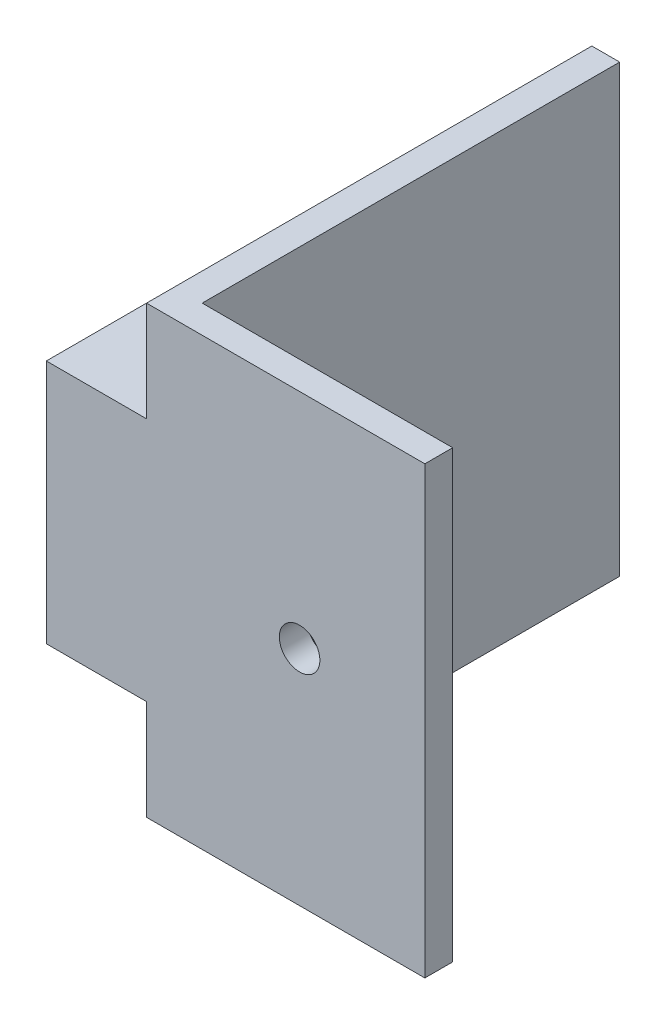
ISO-10303-21;
HEADER;
FILE_DESCRIPTION(('STEP AP214'),'2;1');
FILE_NAME('part.step','',(''),(''),'','','');
FILE_SCHEMA(('AUTOMOTIVE_DESIGN { 1 0 10303 214 1 1 1 1 }'));
ENDSEC;
DATA;
#1=APPLICATION_CONTEXT('core data for automotive mechanical design processes');
#2=APPLICATION_PROTOCOL_DEFINITION('international standard','automotive_design',2000,#1);
#3=PRODUCT_CONTEXT('',#1,'mechanical');
#4=PRODUCT('Part','Part','',(#3));
#5=PRODUCT_RELATED_PRODUCT_CATEGORY('part','',(#4));
#6=PRODUCT_DEFINITION_FORMATION('','',#4);
#7=PRODUCT_DEFINITION_CONTEXT('part definition',#1,'design');
#8=PRODUCT_DEFINITION('design','',#6,#7);
#9=PRODUCT_DEFINITION_SHAPE('','',#8);
#10=(LENGTH_UNIT() NAMED_UNIT(*) SI_UNIT(.MILLI.,.METRE.));
#11=(NAMED_UNIT(*) PLANE_ANGLE_UNIT() SI_UNIT($,.RADIAN.));
#12=(NAMED_UNIT(*) SI_UNIT($,.STERADIAN.) SOLID_ANGLE_UNIT());
#13=UNCERTAINTY_MEASURE_WITH_UNIT(LENGTH_MEASURE(1.E-05),#10,'distance_accuracy_value','');
#14=(GEOMETRIC_REPRESENTATION_CONTEXT(3) GLOBAL_UNCERTAINTY_ASSIGNED_CONTEXT((#13)) GLOBAL_UNIT_ASSIGNED_CONTEXT((#10,
#11,#12)) REPRESENTATION_CONTEXT('',''));
#15=CARTESIAN_POINT('',(0.,0.,0.));
#16=DIRECTION('',(0.,0.,1.));
#17=DIRECTION('',(1.,0.,0.));
#18=AXIS2_PLACEMENT_3D('',#15,#16,#17);
#19=CARTESIAN_POINT('',(0.,50.8,0.));
#20=DIRECTION('',(1.,0.,0.));
#21=DIRECTION('',(0.,0.,-1.));
#22=AXIS2_PLACEMENT_3D('',#19,#20,#21);
#23=PLANE('',#22);
#24=DIRECTION('',(0.,0.,1.));
#25=VECTOR('',#24,1.);
#26=CARTESIAN_POINT('',(0.,11.43,-50.8));
#27=LINE('',#26,#25);
#28=CARTESIAN_POINT('',(0.,11.43,-50.8));
#29=VERTEX_POINT('',#28);
#30=CARTESIAN_POINT('',(0.,11.43,0.));
#31=VERTEX_POINT('',#30);
#32=EDGE_CURVE('E52',#29,#31,#27,.T.);
#33=ORIENTED_EDGE('',*,*,#32,.F.);
#34=DIRECTION('',(0.,-1.,0.));
#35=VECTOR('',#34,1.);
#36=CARTESIAN_POINT('',(0.,50.8,-50.8));
#37=LINE('',#36,#35);
#38=CARTESIAN_POINT('',(0.,0.,-50.8));
#39=VERTEX_POINT('',#38);
#40=EDGE_CURVE('E196',#29,#39,#37,.T.);
#41=ORIENTED_EDGE('',*,*,#40,.T.);
#42=DIRECTION('',(0.,0.,1.));
#43=VECTOR('',#42,1.);
#44=CARTESIAN_POINT('',(0.,0.,0.));
#45=LINE('',#44,#43);
#46=CARTESIAN_POINT('',(0.,0.,0.));
#47=VERTEX_POINT('',#46);
#48=EDGE_CURVE('E167',#39,#47,#45,.T.);
#49=ORIENTED_EDGE('',*,*,#48,.T.);
#50=DIRECTION('',(0.,-1.,0.));
#51=VECTOR('',#50,1.);
#52=CARTESIAN_POINT('',(0.,50.8,0.));
#53=LINE('',#52,#51);
#54=EDGE_CURVE('E57',#31,#47,#53,.T.);
#55=ORIENTED_EDGE('',*,*,#54,.F.);
#56=EDGE_LOOP('',(#33,#41,#49,#55));
#57=FACE_BOUND('',#56,.T.);
#58=ADVANCED_FACE('F35',(#57),#23,.F.);
#59=DIRECTION('',(0.,0.,-1.));
#60=VECTOR('',#59,1.);
#61=CARTESIAN_POINT('',(0.,39.37,-50.8));
#62=LINE('',#61,#60);
#63=CARTESIAN_POINT('',(0.,39.37,0.));
#64=VERTEX_POINT('',#63);
#65=CARTESIAN_POINT('',(0.,39.37,-50.8));
#66=VERTEX_POINT('',#65);
#67=EDGE_CURVE('E152',#64,#66,#62,.T.);
#68=ORIENTED_EDGE('',*,*,#67,.F.);
#69=CARTESIAN_POINT('',(0.,50.8,0.));
#70=VERTEX_POINT('',#69);
#71=EDGE_CURVE('E137',#70,#64,#53,.T.);
#72=ORIENTED_EDGE('',*,*,#71,.F.);
#73=DIRECTION('',(0.,0.,1.));
#74=VECTOR('',#73,1.);
#75=CARTESIAN_POINT('',(0.,50.8,0.));
#76=LINE('',#75,#74);
#77=CARTESIAN_POINT('',(0.,50.8,-50.8));
#78=VERTEX_POINT('',#77);
#79=EDGE_CURVE('E175',#78,#70,#76,.T.);
#80=ORIENTED_EDGE('',*,*,#79,.F.);
#81=EDGE_CURVE('E204',#78,#66,#37,.T.);
#82=ORIENTED_EDGE('',*,*,#81,.T.);
#83=EDGE_LOOP('',(#68,#72,#80,#82));
#84=FACE_BOUND('',#83,.T.);
#85=ADVANCED_FACE('F231',(#84),#23,.F.);
#86=CARTESIAN_POINT('',(31.75,50.8,0.));
#87=DIRECTION('',(0.,0.,-1.));
#88=DIRECTION('',(-1.,0.,0.));
#89=AXIS2_PLACEMENT_3D('',#86,#87,#88);
#90=PLANE('',#89);
#91=CARTESIAN_POINT('',(17.4625,25.4,0.));
#92=DIRECTION('',(0.,0.,-1.));
#93=DIRECTION('',(-1.,0.,0.));
#94=AXIS2_PLACEMENT_3D('',#91,#92,#93);
#95=CIRCLE('',#94,2.3114);
#96=CARTESIAN_POINT('',(15.1511,25.4,0.));
#97=VERTEX_POINT('',#96);
#98=EDGE_CURVE('E141',#97,#97,#95,.T.);
#99=ORIENTED_EDGE('',*,*,#98,.T.);
#100=EDGE_LOOP('',(#99));
#101=FACE_BOUND('',#100,.T.);
#102=DIRECTION('',(1.,0.,0.));
#103=VECTOR('',#102,1.);
#104=CARTESIAN_POINT('',(31.75,0.,0.));
#105=LINE('',#104,#103);
#106=CARTESIAN_POINT('',(31.75,0.,0.));
#107=VERTEX_POINT('',#106);
#108=EDGE_CURVE('E162',#47,#107,#105,.T.);
#109=ORIENTED_EDGE('',*,*,#108,.T.);
#110=DIRECTION('',(0.,-1.,0.));
#111=VECTOR('',#110,1.);
#112=CARTESIAN_POINT('',(31.75,50.8,0.));
#113=LINE('',#112,#111);
#114=CARTESIAN_POINT('',(31.75,50.8,0.));
#115=VERTEX_POINT('',#114);
#116=EDGE_CURVE('E11',#115,#107,#113,.T.);
#117=ORIENTED_EDGE('',*,*,#116,.F.);
#118=DIRECTION('',(1.,0.,0.));
#119=VECTOR('',#118,1.);
#120=CARTESIAN_POINT('',(31.75,50.8,0.));
#121=LINE('',#120,#119);
#122=EDGE_CURVE('E163',#70,#115,#121,.T.);
#123=ORIENTED_EDGE('',*,*,#122,.F.);
#124=ORIENTED_EDGE('',*,*,#71,.T.);
#125=DIRECTION('',(1.,0.,0.));
#126=VECTOR('',#125,1.);
#127=CARTESIAN_POINT('',(-11.43,39.37,0.));
#128=LINE('',#127,#126);
#129=CARTESIAN_POINT('',(-11.43,39.37,0.));
#130=VERTEX_POINT('',#129);
#131=EDGE_CURVE('E117',#130,#64,#128,.T.);
#132=ORIENTED_EDGE('',*,*,#131,.F.);
#133=DIRECTION('',(0.,1.,0.));
#134=VECTOR('',#133,1.);
#135=CARTESIAN_POINT('',(-11.43,11.43,0.));
#136=LINE('',#135,#134);
#137=CARTESIAN_POINT('',(-11.43,11.43,0.));
#138=VERTEX_POINT('',#137);
#139=EDGE_CURVE('E123',#138,#130,#136,.T.);
#140=ORIENTED_EDGE('',*,*,#139,.F.);
#141=DIRECTION('',(1.,0.,0.));
#142=VECTOR('',#141,1.);
#143=CARTESIAN_POINT('',(-11.43,11.43,0.));
#144=LINE('',#143,#142);
#145=EDGE_CURVE('E153',#138,#31,#144,.T.);
#146=ORIENTED_EDGE('',*,*,#145,.T.);
#147=ORIENTED_EDGE('',*,*,#54,.T.);
#148=EDGE_LOOP('',(#109,#117,#123,#124,#132,#140,#146,#147));
#149=FACE_BOUND('',#148,.T.);
#150=ADVANCED_FACE('F37',(#101,#149),#90,.F.);
#151=CARTESIAN_POINT('',(31.75,50.8,-3.175));
#152=DIRECTION('',(-1.,0.,0.));
#153=DIRECTION('',(0.,0.,1.));
#154=AXIS2_PLACEMENT_3D('',#151,#152,#153);
#155=PLANE('',#154);
#156=DIRECTION('',(0.,0.,-1.));
#157=VECTOR('',#156,1.);
#158=CARTESIAN_POINT('',(31.75,0.,-3.175));
#159=LINE('',#158,#157);
#160=CARTESIAN_POINT('',(31.75,0.,-3.175));
#161=VERTEX_POINT('',#160);
#162=EDGE_CURVE('E178',#107,#161,#159,.T.);
#163=ORIENTED_EDGE('',*,*,#162,.T.);
#164=DIRECTION('',(0.,-1.,0.));
#165=VECTOR('',#164,1.);
#166=CARTESIAN_POINT('',(31.75,50.8,-3.175));
#167=LINE('',#166,#165);
#168=CARTESIAN_POINT('',(31.75,50.8,-3.175));
#169=VERTEX_POINT('',#168);
#170=EDGE_CURVE('E44',#169,#161,#167,.T.);
#171=ORIENTED_EDGE('',*,*,#170,.F.);
#172=DIRECTION('',(0.,0.,-1.));
#173=VECTOR('',#172,1.);
#174=CARTESIAN_POINT('',(31.75,50.8,-3.175));
#175=LINE('',#174,#173);
#176=EDGE_CURVE('E166',#115,#169,#175,.T.);
#177=ORIENTED_EDGE('',*,*,#176,.F.);
#178=ORIENTED_EDGE('',*,*,#116,.T.);
#179=EDGE_LOOP('',(#163,#171,#177,#178));
#180=FACE_BOUND('',#179,.T.);
#181=ADVANCED_FACE('F249',(#180),#155,.F.);
#182=CARTESIAN_POINT('',(3.17500000000001,50.8,-3.175));
#183=DIRECTION('',(0.,0.,1.));
#184=DIRECTION('',(1.,0.,0.));
#185=AXIS2_PLACEMENT_3D('',#182,#183,#184);
#186=PLANE('',#185);
#187=CARTESIAN_POINT('',(17.4625,25.4,-3.175));
#188=DIRECTION('',(0.,0.,-1.));
#189=DIRECTION('',(-1.,0.,0.));
#190=AXIS2_PLACEMENT_3D('',#187,#188,#189);
#191=CIRCLE('',#190,2.31139999999999);
#192=CARTESIAN_POINT('',(15.1511,25.4,-3.175));
#193=VERTEX_POINT('',#192);
#194=EDGE_CURVE('E138',#193,#193,#191,.T.);
#195=ORIENTED_EDGE('',*,*,#194,.F.);
#196=EDGE_LOOP('',(#195));
#197=FACE_BOUND('',#196,.T.);
#198=DIRECTION('',(-1.,0.,0.));
#199=VECTOR('',#198,1.);
#200=CARTESIAN_POINT('',(3.17500000000001,0.,-3.175));
#201=LINE('',#200,#199);
#202=CARTESIAN_POINT('',(3.17500000000001,0.,-3.175));
#203=VERTEX_POINT('',#202);
#204=EDGE_CURVE('E180',#161,#203,#201,.T.);
#205=ORIENTED_EDGE('',*,*,#204,.T.);
#206=DIRECTION('',(0.,-1.,0.));
#207=VECTOR('',#206,1.);
#208=CARTESIAN_POINT('',(3.17500000000001,50.8,-3.175));
#209=LINE('',#208,#207);
#210=CARTESIAN_POINT('',(3.17500000000001,50.8,-3.175));
#211=VERTEX_POINT('',#210);
#212=EDGE_CURVE('E200',#211,#203,#209,.T.);
#213=ORIENTED_EDGE('',*,*,#212,.F.);
#214=DIRECTION('',(-1.,0.,0.));
#215=VECTOR('',#214,1.);
#216=CARTESIAN_POINT('',(3.17500000000001,50.8,-3.175));
#217=LINE('',#216,#215);
#218=EDGE_CURVE('E169',#169,#211,#217,.T.);
#219=ORIENTED_EDGE('',*,*,#218,.F.);
#220=ORIENTED_EDGE('',*,*,#170,.T.);
#221=EDGE_LOOP('',(#205,#213,#219,#220));
#222=FACE_BOUND('',#221,.T.);
#223=ADVANCED_FACE('F246',(#197,#222),#186,.F.);
#224=CARTESIAN_POINT('',(3.175,50.8,-50.8));
#225=DIRECTION('',(-1.,0.,0.));
#226=DIRECTION('',(0.,0.,1.));
#227=AXIS2_PLACEMENT_3D('',#224,#225,#226);
#228=PLANE('',#227);
#229=DIRECTION('',(0.,0.,-1.));
#230=VECTOR('',#229,1.);
#231=CARTESIAN_POINT('',(3.175,0.,-50.8));
#232=LINE('',#231,#230);
#233=CARTESIAN_POINT('',(3.175,0.,-50.8));
#234=VERTEX_POINT('',#233);
#235=EDGE_CURVE('E182',#203,#234,#232,.T.);
#236=ORIENTED_EDGE('',*,*,#235,.T.);
#237=DIRECTION('',(0.,-1.,0.));
#238=VECTOR('',#237,1.);
#239=CARTESIAN_POINT('',(3.175,50.8,-50.8));
#240=LINE('',#239,#238);
#241=CARTESIAN_POINT('',(3.175,50.8,-50.8));
#242=VERTEX_POINT('',#241);
#243=EDGE_CURVE('E202',#242,#234,#240,.T.);
#244=ORIENTED_EDGE('',*,*,#243,.F.);
#245=DIRECTION('',(0.,0.,-1.));
#246=VECTOR('',#245,1.);
#247=CARTESIAN_POINT('',(3.175,50.8,-50.8));
#248=LINE('',#247,#246);
#249=EDGE_CURVE('E171',#211,#242,#248,.T.);
#250=ORIENTED_EDGE('',*,*,#249,.F.);
#251=ORIENTED_EDGE('',*,*,#212,.T.);
#252=EDGE_LOOP('',(#236,#244,#250,#251));
#253=FACE_BOUND('',#252,.T.);
#254=ADVANCED_FACE('F243',(#253),#228,.F.);
#255=CARTESIAN_POINT('',(0.,50.8,-50.8));
#256=DIRECTION('',(0.,0.,1.));
#257=DIRECTION('',(1.,0.,0.));
#258=AXIS2_PLACEMENT_3D('',#255,#256,#257);
#259=PLANE('',#258);
#260=DIRECTION('',(-1.,0.,0.));
#261=VECTOR('',#260,1.);
#262=CARTESIAN_POINT('',(0.,0.,-50.8));
#263=LINE('',#262,#261);
#264=EDGE_CURVE('E184',#234,#39,#263,.T.);
#265=ORIENTED_EDGE('',*,*,#264,.T.);
#266=ORIENTED_EDGE('',*,*,#40,.F.);
#267=DIRECTION('',(1.,0.,0.));
#268=VECTOR('',#267,1.);
#269=CARTESIAN_POINT('',(-11.43,11.43,-50.8));
#270=LINE('',#269,#268);
#271=CARTESIAN_POINT('',(-11.43,11.43,-50.8));
#272=VERTEX_POINT('',#271);
#273=EDGE_CURVE('E143',#272,#29,#270,.T.);
#274=ORIENTED_EDGE('',*,*,#273,.F.);
#275=DIRECTION('',(0.,-1.,0.));
#276=VECTOR('',#275,1.);
#277=CARTESIAN_POINT('',(-11.43,11.43,-50.8));
#278=LINE('',#277,#276);
#279=CARTESIAN_POINT('',(-11.43,39.37,-50.8));
#280=VERTEX_POINT('',#279);
#281=EDGE_CURVE('E122',#280,#272,#278,.T.);
#282=ORIENTED_EDGE('',*,*,#281,.F.);
#283=DIRECTION('',(1.,0.,0.));
#284=VECTOR('',#283,1.);
#285=CARTESIAN_POINT('',(-11.43,39.37,-50.8));
#286=LINE('',#285,#284);
#287=EDGE_CURVE('E119',#280,#66,#286,.T.);
#288=ORIENTED_EDGE('',*,*,#287,.T.);
#289=ORIENTED_EDGE('',*,*,#81,.F.);
#290=DIRECTION('',(-1.,0.,0.));
#291=VECTOR('',#290,1.);
#292=CARTESIAN_POINT('',(0.,50.8,-50.8));
#293=LINE('',#292,#291);
#294=EDGE_CURVE('E173',#242,#78,#293,.T.);
#295=ORIENTED_EDGE('',*,*,#294,.F.);
#296=ORIENTED_EDGE('',*,*,#243,.T.);
#297=EDGE_LOOP('',(#265,#266,#274,#282,#288,#289,#295,#296));
#298=FACE_BOUND('',#297,.T.);
#299=ADVANCED_FACE('F214',(#298),#259,.F.);
#300=CARTESIAN_POINT('',(0.,50.8,0.));
#301=DIRECTION('',(0.,-1.,0.));
#302=DIRECTION('',(0.,0.,-1.));
#303=AXIS2_PLACEMENT_3D('',#300,#301,#302);
#304=PLANE('',#303);
#305=ORIENTED_EDGE('',*,*,#122,.T.);
#306=ORIENTED_EDGE('',*,*,#176,.T.);
#307=ORIENTED_EDGE('',*,*,#218,.T.);
#308=ORIENTED_EDGE('',*,*,#249,.T.);
#309=ORIENTED_EDGE('',*,*,#294,.T.);
#310=ORIENTED_EDGE('',*,*,#79,.T.);
#311=EDGE_LOOP('',(#305,#306,#307,#308,#309,#310));
#312=FACE_BOUND('',#311,.T.);
#313=ADVANCED_FACE('F242',(#312),#304,.F.);
#314=CARTESIAN_POINT('',(0.,0.,0.));
#315=DIRECTION('',(0.,-1.,0.));
#316=DIRECTION('',(0.,0.,-1.));
#317=AXIS2_PLACEMENT_3D('',#314,#315,#316);
#318=PLANE('',#317);
#319=ORIENTED_EDGE('',*,*,#108,.F.);
#320=ORIENTED_EDGE('',*,*,#48,.F.);
#321=ORIENTED_EDGE('',*,*,#264,.F.);
#322=ORIENTED_EDGE('',*,*,#235,.F.);
#323=ORIENTED_EDGE('',*,*,#204,.F.);
#324=ORIENTED_EDGE('',*,*,#162,.F.);
#325=EDGE_LOOP('',(#319,#320,#321,#322,#323,#324));
#326=FACE_BOUND('',#325,.T.);
#327=ADVANCED_FACE('F238',(#326),#318,.T.);
#328=CARTESIAN_POINT('',(17.4625,25.4,-3.175));
#329=DIRECTION('',(0.,0.,-1.));
#330=DIRECTION('',(-1.,0.,0.));
#331=AXIS2_PLACEMENT_3D('',#328,#329,#330);
#332=CYLINDRICAL_SURFACE('',#331,2.31139999999999);
#333=ORIENTED_EDGE('',*,*,#98,.F.);
#334=EDGE_LOOP('',(#333));
#335=FACE_BOUND('',#334,.T.);
#336=ORIENTED_EDGE('',*,*,#194,.T.);
#337=EDGE_LOOP('',(#336));
#338=FACE_BOUND('',#337,.T.);
#339=ADVANCED_FACE('F228',(#335,#338),#332,.F.);
#340=CARTESIAN_POINT('',(-11.43,39.37,-50.8));
#341=DIRECTION('',(0.,-1.,0.));
#342=DIRECTION('',(0.,0.,-1.));
#343=AXIS2_PLACEMENT_3D('',#340,#341,#342);
#344=PLANE('',#343);
#345=ORIENTED_EDGE('',*,*,#67,.T.);
#346=ORIENTED_EDGE('',*,*,#287,.F.);
#347=DIRECTION('',(0.,0.,-1.));
#348=VECTOR('',#347,1.);
#349=CARTESIAN_POINT('',(-11.43,39.37,-50.8));
#350=LINE('',#349,#348);
#351=EDGE_CURVE('E112',#130,#280,#350,.T.);
#352=ORIENTED_EDGE('',*,*,#351,.F.);
#353=ORIENTED_EDGE('',*,*,#131,.T.);
#354=EDGE_LOOP('',(#345,#346,#352,#353));
#355=FACE_BOUND('',#354,.T.);
#356=ADVANCED_FACE('F115',(#355),#344,.F.);
#357=CARTESIAN_POINT('',(-11.43,11.43,-50.8));
#358=DIRECTION('',(0.,1.,0.));
#359=DIRECTION('',(0.,0.,1.));
#360=AXIS2_PLACEMENT_3D('',#357,#358,#359);
#361=PLANE('',#360);
#362=ORIENTED_EDGE('',*,*,#32,.T.);
#363=ORIENTED_EDGE('',*,*,#145,.F.);
#364=DIRECTION('',(0.,0.,1.));
#365=VECTOR('',#364,1.);
#366=CARTESIAN_POINT('',(-11.43,11.43,-50.8));
#367=LINE('',#366,#365);
#368=EDGE_CURVE('E128',#272,#138,#367,.T.);
#369=ORIENTED_EDGE('',*,*,#368,.F.);
#370=ORIENTED_EDGE('',*,*,#273,.T.);
#371=EDGE_LOOP('',(#362,#363,#369,#370));
#372=FACE_BOUND('',#371,.T.);
#373=ADVANCED_FACE('F220',(#372),#361,.F.);
#374=CARTESIAN_POINT('',(-11.43,39.37,0.));
#375=DIRECTION('',(1.,0.,0.));
#376=DIRECTION('',(0.,0.,-1.));
#377=AXIS2_PLACEMENT_3D('',#374,#375,#376);
#378=PLANE('',#377);
#379=ORIENTED_EDGE('',*,*,#139,.T.);
#380=ORIENTED_EDGE('',*,*,#351,.T.);
#381=ORIENTED_EDGE('',*,*,#281,.T.);
#382=ORIENTED_EDGE('',*,*,#368,.T.);
#383=EDGE_LOOP('',(#379,#380,#381,#382));
#384=FACE_BOUND('',#383,.T.);
#385=ADVANCED_FACE('F126',(#384),#378,.F.);
#386=CLOSED_SHELL('',(#58,#85,#150,#181,#223,#254,#299,#313,#327,#339,#356,#373,#385));
#387=MANIFOLD_SOLID_BREP('B2',#386);
#388=ADVANCED_BREP_SHAPE_REPRESENTATION('',(#18,#387),#14);
#389=SHAPE_DEFINITION_REPRESENTATION(#9,#388);
ENDSEC;
END-ISO-10303-21;
